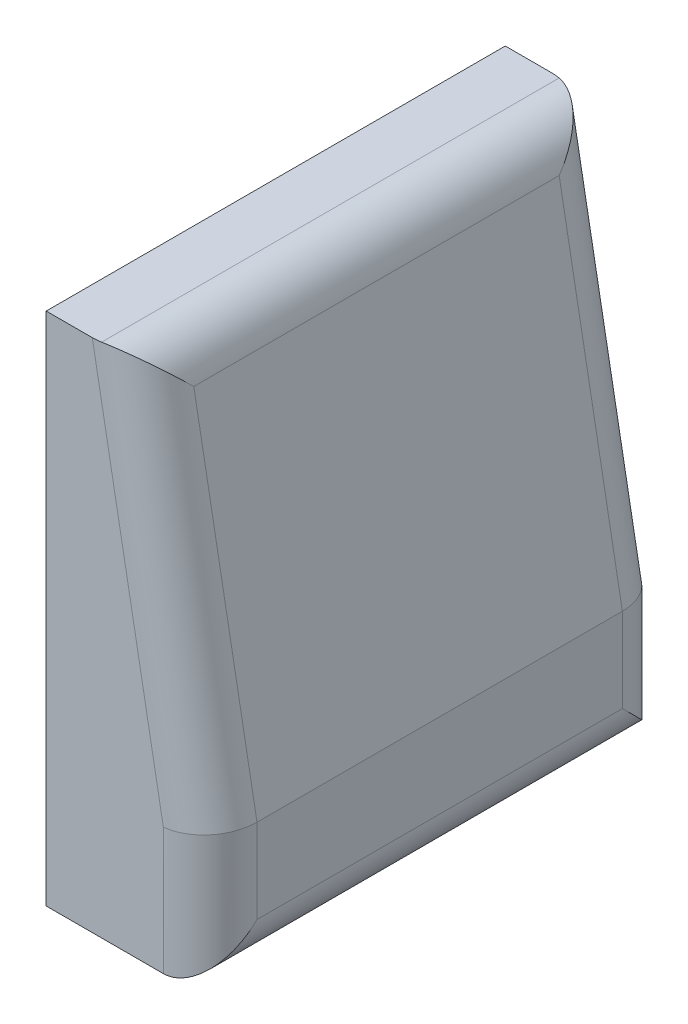
ISO-10303-21;
HEADER;
FILE_DESCRIPTION(('STEP AP214'),'2;1');
FILE_NAME('part.step','',(''),(''),'','','');
FILE_SCHEMA(('AUTOMOTIVE_DESIGN { 1 0 10303 214 1 1 1 1 }'));
ENDSEC;
DATA;
#1=APPLICATION_CONTEXT('core data for automotive mechanical design processes');
#2=APPLICATION_PROTOCOL_DEFINITION('international standard','automotive_design',2000,#1);
#3=PRODUCT_CONTEXT('',#1,'mechanical');
#4=PRODUCT('Part','Part','',(#3));
#5=PRODUCT_RELATED_PRODUCT_CATEGORY('part','',(#4));
#6=PRODUCT_DEFINITION_FORMATION('','',#4);
#7=PRODUCT_DEFINITION_CONTEXT('part definition',#1,'design');
#8=PRODUCT_DEFINITION('design','',#6,#7);
#9=PRODUCT_DEFINITION_SHAPE('','',#8);
#10=(LENGTH_UNIT() NAMED_UNIT(*) SI_UNIT(.MILLI.,.METRE.));
#11=(NAMED_UNIT(*) PLANE_ANGLE_UNIT() SI_UNIT($,.RADIAN.));
#12=(NAMED_UNIT(*) SI_UNIT($,.STERADIAN.) SOLID_ANGLE_UNIT());
#13=UNCERTAINTY_MEASURE_WITH_UNIT(LENGTH_MEASURE(1.E-05),#10,'distance_accuracy_value','');
#14=(GEOMETRIC_REPRESENTATION_CONTEXT(3) GLOBAL_UNCERTAINTY_ASSIGNED_CONTEXT((#13)) GLOBAL_UNIT_ASSIGNED_CONTEXT((#10,
#11,#12)) REPRESENTATION_CONTEXT('',''));
#15=CARTESIAN_POINT('',(0.,0.,0.));
#16=DIRECTION('',(0.,0.,1.));
#17=DIRECTION('',(1.,0.,0.));
#18=AXIS2_PLACEMENT_3D('',#15,#16,#17);
#19=CARTESIAN_POINT('',(200.,550.,490.));
#20=DIRECTION('',(0.,-1.,0.));
#21=DIRECTION('',(0.,0.,-1.));
#22=AXIS2_PLACEMENT_3D('',#19,#20,#21);
#23=PLANE('',#22);
#24=DIRECTION('',(0.,0.,-1.));
#25=VECTOR('',#24,1.);
#26=CARTESIAN_POINT('',(116.633338798208,550.,490.));
#27=LINE('',#26,#25);
#28=CARTESIAN_POINT('',(116.633338798208,550.,488.367740670723));
#29=VERTEX_POINT('',#28);
#30=CARTESIAN_POINT('',(116.633338798208,550.,-488.367740670723));
#31=VERTEX_POINT('',#30);
#32=EDGE_CURVE('E170',#29,#31,#27,.T.);
#33=ORIENTED_EDGE('',*,*,#32,.T.);
#34=CARTESIAN_POINT('',(98.3406558713786,550.,-390.));
#35=DIRECTION('',(0.,-1.,0.));
#36=DIRECTION('',(-1.,0.,0.));
#37=AXIS2_PLACEMENT_3D('',#34,#35,#36);
#38=ELLIPSE('',#37,101.659344128622,100.);
#39=CARTESIAN_POINT('',(98.3406558713786,550.,-490.));
#40=VERTEX_POINT('',#39);
#41=EDGE_CURVE('E176',#31,#40,#38,.F.);
#42=ORIENTED_EDGE('',*,*,#41,.T.);
#43=DIRECTION('',(-1.,0.,0.));
#44=VECTOR('',#43,1.);
#45=CARTESIAN_POINT('',(200.,550.,-490.));
#46=LINE('',#45,#44);
#47=CARTESIAN_POINT('',(1.37633874981097E-13,550.,-490.));
#48=VERTEX_POINT('',#47);
#49=EDGE_CURVE('E135',#40,#48,#46,.T.);
#50=ORIENTED_EDGE('',*,*,#49,.T.);
#51=DIRECTION('',(0.,0.,-1.));
#52=VECTOR('',#51,1.);
#53=CARTESIAN_POINT('',(1.37633874981097E-13,550.,490.));
#54=LINE('',#53,#52);
#55=CARTESIAN_POINT('',(1.37633874981097E-13,550.,490.));
#56=VERTEX_POINT('',#55);
#57=EDGE_CURVE('E128',#56,#48,#54,.T.);
#58=ORIENTED_EDGE('',*,*,#57,.F.);
#59=DIRECTION('',(-1.,0.,0.));
#60=VECTOR('',#59,1.);
#61=CARTESIAN_POINT('',(200.,550.,490.));
#62=LINE('',#61,#60);
#63=CARTESIAN_POINT('',(98.3406558713786,550.,490.));
#64=VERTEX_POINT('',#63);
#65=EDGE_CURVE('E114',#64,#56,#62,.T.);
#66=ORIENTED_EDGE('',*,*,#65,.F.);
#67=CARTESIAN_POINT('',(98.3406558713786,550.,390.));
#68=DIRECTION('',(0.,-1.,0.));
#69=DIRECTION('',(1.,0.,0.));
#70=AXIS2_PLACEMENT_3D('',#67,#68,#69);
#71=ELLIPSE('',#70,101.659344128622,100.);
#72=EDGE_CURVE('E173',#64,#29,#71,.F.);
#73=ORIENTED_EDGE('',*,*,#72,.T.);
#74=EDGE_LOOP('',(#33,#42,#50,#58,#66,#73));
#75=FACE_BOUND('',#74,.T.);
#76=ADVANCED_FACE('F42',(#75),#23,.F.);
#77=CARTESIAN_POINT('',(1.37633874981097E-13,550.,490.));
#78=DIRECTION('',(1.,0.,0.));
#79=DIRECTION('',(0.,0.,-1.));
#80=AXIS2_PLACEMENT_3D('',#77,#78,#79);
#81=PLANE('',#80);
#82=DIRECTION('',(0.,-1.,0.));
#83=VECTOR('',#82,1.);
#84=CARTESIAN_POINT('',(1.37633874981097E-13,550.,-490.));
#85=LINE('',#84,#83);
#86=CARTESIAN_POINT('',(1.37633874981097E-13,-550.,-490.));
#87=VERTEX_POINT('',#86);
#88=EDGE_CURVE('E209',#48,#87,#85,.T.);
#89=ORIENTED_EDGE('',*,*,#88,.T.);
#90=DIRECTION('',(0.,0.,-1.));
#91=VECTOR('',#90,1.);
#92=CARTESIAN_POINT('',(1.37633874981097E-13,-550.,490.));
#93=LINE('',#92,#91);
#94=CARTESIAN_POINT('',(1.37633874981097E-13,-550.,490.));
#95=VERTEX_POINT('',#94);
#96=EDGE_CURVE('E130',#95,#87,#93,.T.);
#97=ORIENTED_EDGE('',*,*,#96,.F.);
#98=DIRECTION('',(0.,-1.,0.));
#99=VECTOR('',#98,1.);
#100=CARTESIAN_POINT('',(1.37633874981097E-13,550.,490.));
#101=LINE('',#100,#99);
#102=EDGE_CURVE('E117',#56,#95,#101,.T.);
#103=ORIENTED_EDGE('',*,*,#102,.F.);
#104=ORIENTED_EDGE('',*,*,#57,.T.);
#105=EDGE_LOOP('',(#89,#97,#103,#104));
#106=FACE_BOUND('',#105,.T.);
#107=ADVANCED_FACE('F127',(#106),#81,.F.);
#108=CARTESIAN_POINT('',(1.37633874981097E-13,-550.,490.));
#109=DIRECTION('',(0.,1.,0.));
#110=DIRECTION('',(0.,0.,1.));
#111=AXIS2_PLACEMENT_3D('',#108,#109,#110);
#112=PLANE('',#111);
#113=DIRECTION('',(1.,0.,0.));
#114=VECTOR('',#113,1.);
#115=CARTESIAN_POINT('',(1.37633874981097E-13,-550.,-490.));
#116=LINE('',#115,#114);
#117=CARTESIAN_POINT('',(250.,-550.,-490.));
#118=VERTEX_POINT('',#117);
#119=EDGE_CURVE('E123',#87,#118,#116,.T.);
#120=ORIENTED_EDGE('',*,*,#119,.T.);
#121=DIRECTION('',(0.,0.,-1.));
#122=VECTOR('',#121,1.);
#123=CARTESIAN_POINT('',(250.,-550.,490.));
#124=LINE('',#123,#122);
#125=CARTESIAN_POINT('',(250.,-550.,490.));
#126=VERTEX_POINT('',#125);
#127=EDGE_CURVE('E66',#118,#126,#124,.F.);
#128=ORIENTED_EDGE('',*,*,#127,.T.);
#129=DIRECTION('',(1.,0.,0.));
#130=VECTOR('',#129,1.);
#131=CARTESIAN_POINT('',(1.37633874981097E-13,-550.,490.));
#132=LINE('',#131,#130);
#133=EDGE_CURVE('E132',#95,#126,#132,.T.);
#134=ORIENTED_EDGE('',*,*,#133,.F.);
#135=ORIENTED_EDGE('',*,*,#96,.T.);
#136=EDGE_LOOP('',(#120,#128,#134,#135));
#137=FACE_BOUND('',#136,.T.);
#138=ADVANCED_FACE('F254',(#137),#112,.F.);
#139=CARTESIAN_POINT('',(350.,-550.,490.));
#140=DIRECTION('',(-1.,0.,0.));
#141=DIRECTION('',(0.,0.,1.));
#142=AXIS2_PLACEMENT_3D('',#139,#140,#141);
#143=PLANE('',#142);
#144=DIRECTION('',(0.,0.,-1.));
#145=VECTOR('',#144,1.);
#146=CARTESIAN_POINT('',(350.,-450.,490.));
#147=LINE('',#146,#145);
#148=CARTESIAN_POINT('',(350.,-450.,390.));
#149=VERTEX_POINT('',#148);
#150=CARTESIAN_POINT('',(350.,-450.,-390.));
#151=VERTEX_POINT('',#150);
#152=EDGE_CURVE('E142',#149,#151,#147,.T.);
#153=ORIENTED_EDGE('',*,*,#152,.T.);
#154=DIRECTION('',(0.,1.,0.));
#155=VECTOR('',#154,1.);
#156=CARTESIAN_POINT('',(350.,-550.,-390.));
#157=LINE('',#156,#155);
#158=CARTESIAN_POINT('',(350.,-270.,-390.));
#159=VERTEX_POINT('',#158);
#160=EDGE_CURVE('E150',#151,#159,#157,.T.);
#161=ORIENTED_EDGE('',*,*,#160,.T.);
#162=DIRECTION('',(0.,0.,-1.));
#163=VECTOR('',#162,1.);
#164=CARTESIAN_POINT('',(350.,-270.,490.));
#165=LINE('',#164,#163);
#166=CARTESIAN_POINT('',(350.,-270.,390.));
#167=VERTEX_POINT('',#166);
#168=EDGE_CURVE('E144',#167,#159,#165,.T.);
#169=ORIENTED_EDGE('',*,*,#168,.F.);
#170=DIRECTION('',(0.,1.,0.));
#171=VECTOR('',#170,1.);
#172=CARTESIAN_POINT('',(350.,-550.,390.));
#173=LINE('',#172,#171);
#174=EDGE_CURVE('E138',#167,#149,#173,.F.);
#175=ORIENTED_EDGE('',*,*,#174,.T.);
#176=EDGE_LOOP('',(#153,#161,#169,#175));
#177=FACE_BOUND('',#176,.T.);
#178=ADVANCED_FACE('F229',(#177),#143,.F.);
#179=CARTESIAN_POINT('',(350.,-270.,490.));
#180=DIRECTION('',(-0.983677406707226,-0.17994098903181,0.));
#181=DIRECTION('',(0.17994098903181,-0.983677406707226,0.));
#182=AXIS2_PLACEMENT_3D('',#179,#180,#181);
#183=PLANE('',#182);
#184=ORIENTED_EDGE('',*,*,#168,.T.);
#185=DIRECTION('',(-0.17994098903181,0.983677406707226,0.));
#186=VECTOR('',#185,1.);
#187=CARTESIAN_POINT('',(350.,-270.,-390.));
#188=LINE('',#187,#186);
#189=CARTESIAN_POINT('',(215.00107946893,467.994098903181,-390.));
#190=VERTEX_POINT('',#189);
#191=EDGE_CURVE('E167',#159,#190,#188,.T.);
#192=ORIENTED_EDGE('',*,*,#191,.T.);
#193=DIRECTION('',(0.,0.,-1.));
#194=VECTOR('',#193,1.);
#195=CARTESIAN_POINT('',(215.00107946893,467.994098903181,490.));
#196=LINE('',#195,#194);
#197=CARTESIAN_POINT('',(215.00107946893,467.994098903181,390.));
#198=VERTEX_POINT('',#197);
#199=EDGE_CURVE('E161',#190,#198,#196,.F.);
#200=ORIENTED_EDGE('',*,*,#199,.T.);
#201=DIRECTION('',(-0.17994098903181,0.983677406707226,0.));
#202=VECTOR('',#201,1.);
#203=CARTESIAN_POINT('',(350.,-270.,390.));
#204=LINE('',#203,#202);
#205=EDGE_CURVE('E164',#198,#167,#204,.F.);
#206=ORIENTED_EDGE('',*,*,#205,.T.);
#207=EDGE_LOOP('',(#184,#192,#200,#206));
#208=FACE_BOUND('',#207,.T.);
#209=ADVANCED_FACE('F246',(#208),#183,.F.);
#210=CARTESIAN_POINT('',(0.,0.,490.));
#211=DIRECTION('',(0.,0.,1.));
#212=DIRECTION('',(1.,0.,0.));
#213=AXIS2_PLACEMENT_3D('',#210,#211,#212);
#214=PLANE('',#213);
#215=ORIENTED_EDGE('',*,*,#133,.T.);
#216=DIRECTION('',(0.,1.,0.));
#217=VECTOR('',#216,1.);
#218=CARTESIAN_POINT('',(250.,-270.,490.));
#219=LINE('',#218,#217);
#220=CARTESIAN_POINT('',(250.,-279.071081236465,490.));
#221=VERTEX_POINT('',#220);
#222=EDGE_CURVE('E11',#126,#221,#219,.T.);
#223=ORIENTED_EDGE('',*,*,#222,.T.);
#224=DIRECTION('',(-0.17994098903181,0.983677406707226,0.));
#225=VECTOR('',#224,1.);
#226=CARTESIAN_POINT('',(101.632259329278,532.005901096819,490.));
#227=LINE('',#226,#225);
#228=EDGE_CURVE('E52',#221,#64,#227,.T.);
#229=ORIENTED_EDGE('',*,*,#228,.T.);
#230=ORIENTED_EDGE('',*,*,#65,.T.);
#231=ORIENTED_EDGE('',*,*,#102,.T.);
#232=EDGE_LOOP('',(#215,#223,#229,#230,#231));
#233=FACE_BOUND('',#232,.T.);
#234=ADVANCED_FACE('F116',(#233),#214,.T.);
#235=CARTESIAN_POINT('',(0.,0.,-490.));
#236=DIRECTION('',(0.,0.,1.));
#237=DIRECTION('',(1.,0.,0.));
#238=AXIS2_PLACEMENT_3D('',#235,#236,#237);
#239=PLANE('',#238);
#240=DIRECTION('',(-0.17994098903181,0.983677406707226,0.));
#241=VECTOR('',#240,1.);
#242=CARTESIAN_POINT('',(192.508644420658,35.2149959306081,-490.));
#243=LINE('',#242,#241);
#244=CARTESIAN_POINT('',(250.,-279.071081236465,-490.));
#245=VERTEX_POINT('',#244);
#246=EDGE_CURVE('E154',#40,#245,#243,.F.);
#247=ORIENTED_EDGE('',*,*,#246,.T.);
#248=DIRECTION('',(0.,1.,0.));
#249=VECTOR('',#248,1.);
#250=CARTESIAN_POINT('',(250.,0.,-490.));
#251=LINE('',#250,#249);
#252=EDGE_CURVE('E157',#245,#118,#251,.F.);
#253=ORIENTED_EDGE('',*,*,#252,.T.);
#254=ORIENTED_EDGE('',*,*,#119,.F.);
#255=ORIENTED_EDGE('',*,*,#88,.F.);
#256=ORIENTED_EDGE('',*,*,#49,.F.);
#257=EDGE_LOOP('',(#247,#253,#254,#255,#256));
#258=FACE_BOUND('',#257,.T.);
#259=ADVANCED_FACE('F242',(#258),#239,.F.);
#260=CARTESIAN_POINT('',(192.508644420658,35.2149959306081,390.));
#261=DIRECTION('',(0.17994098903181,-0.983677406707226,0.));
#262=DIRECTION('',(0.983677406707226,0.17994098903181,0.));
#263=AXIS2_PLACEMENT_3D('',#260,#261,#262);
#264=CYLINDRICAL_SURFACE('',#263,100.);
#265=ORIENTED_EDGE('',*,*,#72,.F.);
#266=ORIENTED_EDGE('',*,*,#228,.F.);
#267=CARTESIAN_POINT('',(250.,-279.071081236465,390.));
#268=DIRECTION('',(0.0903398950983827,-0.995910991682296,0.));
#269=DIRECTION('',(0.995910991682295,0.0903398950983824,0.));
#270=AXIS2_PLACEMENT_3D('',#267,#268,#269);
#271=ELLIPSE('',#270,100.410579695561,100.);
#272=EDGE_CURVE('E46',#167,#221,#271,.T.);
#273=ORIENTED_EDGE('',*,*,#272,.F.);
#274=ORIENTED_EDGE('',*,*,#205,.F.);
#275=CARTESIAN_POINT('',(116.633338798208,450.,390.));
#276=DIRECTION('',(-0.127237493557807,0.695564964782677,-0.707106781186547));
#277=DIRECTION('',(0.127237493557807,-0.695564964782677,-0.707106781186547));
#278=AXIS2_PLACEMENT_3D('',#275,#276,#277);
#279=ELLIPSE('',#278,141.42135623731,100.);
#280=EDGE_CURVE('E196',#29,#198,#279,.T.);
#281=ORIENTED_EDGE('',*,*,#280,.F.);
#282=EDGE_LOOP('',(#265,#266,#273,#274,#281));
#283=FACE_BOUND('',#282,.T.);
#284=ADVANCED_FACE('F44',(#283),#264,.T.);
#285=CARTESIAN_POINT('',(250.,0.,390.));
#286=DIRECTION('',(0.,-1.,0.));
#287=DIRECTION('',(0.,0.,-1.));
#288=AXIS2_PLACEMENT_3D('',#285,#286,#287);
#289=CYLINDRICAL_SURFACE('',#288,100.);
#290=ORIENTED_EDGE('',*,*,#272,.T.);
#291=ORIENTED_EDGE('',*,*,#222,.F.);
#292=CARTESIAN_POINT('',(250.,-450.,390.));
#293=DIRECTION('',(0.,-0.707106781186547,-0.707106781186547));
#294=DIRECTION('',(0.,-0.707106781186547,0.707106781186547));
#295=AXIS2_PLACEMENT_3D('',#292,#293,#294);
#296=ELLIPSE('',#295,141.42135623731,100.);
#297=EDGE_CURVE('E193',#149,#126,#296,.T.);
#298=ORIENTED_EDGE('',*,*,#297,.F.);
#299=ORIENTED_EDGE('',*,*,#174,.F.);
#300=EDGE_LOOP('',(#290,#291,#298,#299));
#301=FACE_BOUND('',#300,.T.);
#302=ADVANCED_FACE('F222',(#301),#289,.T.);
#303=CARTESIAN_POINT('',(116.633338798208,450.,490.));
#304=DIRECTION('',(0.,0.,-1.));
#305=DIRECTION('',(-1.,0.,0.));
#306=AXIS2_PLACEMENT_3D('',#303,#304,#305);
#307=CYLINDRICAL_SURFACE('',#306,100.);
#308=ORIENTED_EDGE('',*,*,#280,.T.);
#309=ORIENTED_EDGE('',*,*,#199,.F.);
#310=CARTESIAN_POINT('',(116.633338798208,450.,-390.));
#311=DIRECTION('',(0.127237493557807,-0.695564964782677,-0.707106781186547));
#312=DIRECTION('',(-0.127237493557807,0.695564964782677,-0.707106781186547));
#313=AXIS2_PLACEMENT_3D('',#310,#311,#312);
#314=ELLIPSE('',#313,141.42135623731,100.);
#315=EDGE_CURVE('E189',#31,#190,#314,.T.);
#316=ORIENTED_EDGE('',*,*,#315,.F.);
#317=ORIENTED_EDGE('',*,*,#32,.F.);
#318=EDGE_LOOP('',(#308,#309,#316,#317));
#319=FACE_BOUND('',#318,.T.);
#320=ADVANCED_FACE('F234',(#319),#307,.T.);
#321=CARTESIAN_POINT('',(250.,-450.,490.));
#322=DIRECTION('',(0.,0.,-1.));
#323=DIRECTION('',(-1.,0.,0.));
#324=AXIS2_PLACEMENT_3D('',#321,#322,#323);
#325=CYLINDRICAL_SURFACE('',#324,100.);
#326=ORIENTED_EDGE('',*,*,#297,.T.);
#327=ORIENTED_EDGE('',*,*,#127,.F.);
#328=CARTESIAN_POINT('',(250.,-450.,-390.));
#329=DIRECTION('',(0.,0.707106781186547,-0.707106781186547));
#330=DIRECTION('',(0.,-0.707106781186547,-0.707106781186547));
#331=AXIS2_PLACEMENT_3D('',#328,#329,#330);
#332=ELLIPSE('',#331,141.42135623731,100.);
#333=EDGE_CURVE('E186',#151,#118,#332,.T.);
#334=ORIENTED_EDGE('',*,*,#333,.F.);
#335=ORIENTED_EDGE('',*,*,#152,.F.);
#336=EDGE_LOOP('',(#326,#327,#334,#335));
#337=FACE_BOUND('',#336,.T.);
#338=ADVANCED_FACE('F225',(#337),#325,.T.);
#339=CARTESIAN_POINT('',(251.632259329277,-287.994098903181,-390.));
#340=DIRECTION('',(-0.17994098903181,0.983677406707226,0.));
#341=DIRECTION('',(-0.983677406707226,-0.17994098903181,0.));
#342=AXIS2_PLACEMENT_3D('',#339,#340,#341);
#343=CYLINDRICAL_SURFACE('',#342,100.);
#344=ORIENTED_EDGE('',*,*,#315,.T.);
#345=ORIENTED_EDGE('',*,*,#191,.F.);
#346=CARTESIAN_POINT('',(250.,-279.071081236464,-390.));
#347=DIRECTION('',(-0.0903398950983827,0.995910991682296,0.));
#348=DIRECTION('',(-0.995910991682295,-0.0903398950983824,0.));
#349=AXIS2_PLACEMENT_3D('',#346,#347,#348);
#350=ELLIPSE('',#349,100.410579695561,100.);
#351=EDGE_CURVE('E183',#245,#159,#350,.F.);
#352=ORIENTED_EDGE('',*,*,#351,.F.);
#353=ORIENTED_EDGE('',*,*,#246,.F.);
#354=ORIENTED_EDGE('',*,*,#41,.F.);
#355=EDGE_LOOP('',(#344,#345,#352,#353,#354));
#356=FACE_BOUND('',#355,.T.);
#357=ADVANCED_FACE('F238',(#356),#343,.T.);
#358=CARTESIAN_POINT('',(250.,-550.,-390.));
#359=DIRECTION('',(0.,1.,0.));
#360=DIRECTION('',(0.,0.,1.));
#361=AXIS2_PLACEMENT_3D('',#358,#359,#360);
#362=CYLINDRICAL_SURFACE('',#361,100.);
#363=ORIENTED_EDGE('',*,*,#333,.T.);
#364=ORIENTED_EDGE('',*,*,#252,.F.);
#365=ORIENTED_EDGE('',*,*,#351,.T.);
#366=ORIENTED_EDGE('',*,*,#160,.F.);
#367=EDGE_LOOP('',(#363,#364,#365,#366));
#368=FACE_BOUND('',#367,.T.);
#369=ADVANCED_FACE('F245',(#368),#362,.T.);
#370=CLOSED_SHELL('',(#76,#107,#138,#178,#209,#234,#259,#284,#302,#320,#338,#357,#369));
#371=MANIFOLD_SOLID_BREP('B2',#370);
#372=ADVANCED_BREP_SHAPE_REPRESENTATION('',(#18,#371),#14);
#373=SHAPE_DEFINITION_REPRESENTATION(#9,#372);
ENDSEC;
END-ISO-10303-21;
